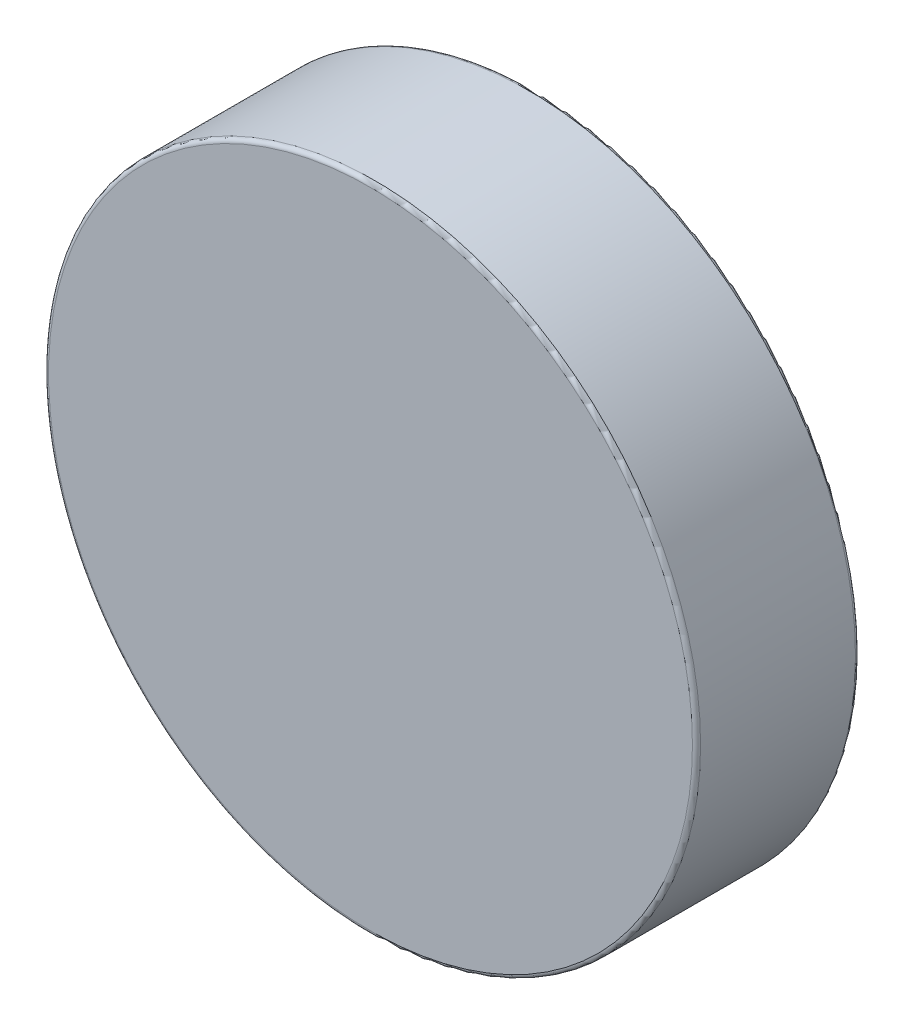
ISO-10303-21;
HEADER;
FILE_DESCRIPTION(('STEP AP214'),'2;1');
FILE_NAME('part.step','',(''),(''),'','','');
FILE_SCHEMA(('AUTOMOTIVE_DESIGN { 1 0 10303 214 1 1 1 1 }'));
ENDSEC;
DATA;
#1=APPLICATION_CONTEXT('core data for automotive mechanical design processes');
#2=APPLICATION_PROTOCOL_DEFINITION('international standard','automotive_design',2000,#1);
#3=PRODUCT_CONTEXT('',#1,'mechanical');
#4=PRODUCT('Part','Part','',(#3));
#5=PRODUCT_RELATED_PRODUCT_CATEGORY('part','',(#4));
#6=PRODUCT_DEFINITION_FORMATION('','',#4);
#7=PRODUCT_DEFINITION_CONTEXT('part definition',#1,'design');
#8=PRODUCT_DEFINITION('design','',#6,#7);
#9=PRODUCT_DEFINITION_SHAPE('','',#8);
#10=(LENGTH_UNIT() NAMED_UNIT(*) SI_UNIT(.MILLI.,.METRE.));
#11=(NAMED_UNIT(*) PLANE_ANGLE_UNIT() SI_UNIT($,.RADIAN.));
#12=(NAMED_UNIT(*) SI_UNIT($,.STERADIAN.) SOLID_ANGLE_UNIT());
#13=UNCERTAINTY_MEASURE_WITH_UNIT(LENGTH_MEASURE(1.E-05),#10,'distance_accuracy_value','');
#14=(GEOMETRIC_REPRESENTATION_CONTEXT(3) GLOBAL_UNCERTAINTY_ASSIGNED_CONTEXT((#13)) GLOBAL_UNIT_ASSIGNED_CONTEXT((#10,
#11,#12)) REPRESENTATION_CONTEXT('',''));
#15=CARTESIAN_POINT('',(0.,0.,0.));
#16=DIRECTION('',(0.,0.,1.));
#17=DIRECTION('',(1.,0.,0.));
#18=AXIS2_PLACEMENT_3D('',#15,#16,#17);
#19=CARTESIAN_POINT('',(0.,0.,0.79375));
#20=DIRECTION('',(0.,0.,-1.));
#21=DIRECTION('',(-1.,0.,0.));
#22=AXIS2_PLACEMENT_3D('',#19,#20,#21);
#23=CYLINDRICAL_SURFACE('',#22,3.175);
#24=CARTESIAN_POINT('',(0.,0.,-0.7540625));
#25=DIRECTION('',(0.,0.,1.));
#26=DIRECTION('',(1.,0.,0.));
#27=AXIS2_PLACEMENT_3D('',#24,#25,#26);
#28=CIRCLE('',#27,3.175);
#29=CARTESIAN_POINT('',(3.175,0.,-0.7540625));
#30=VERTEX_POINT('',#29);
#31=EDGE_CURVE('E41',#30,#30,#28,.T.);
#32=ORIENTED_EDGE('',*,*,#31,.T.);
#33=EDGE_LOOP('',(#32));
#34=FACE_BOUND('',#33,.T.);
#35=CARTESIAN_POINT('',(0.,0.,0.7540625));
#36=DIRECTION('',(0.,0.,1.));
#37=DIRECTION('',(1.,0.,0.));
#38=AXIS2_PLACEMENT_3D('',#35,#36,#37);
#39=CIRCLE('',#38,3.175);
#40=CARTESIAN_POINT('',(3.175,0.,0.7540625));
#41=VERTEX_POINT('',#40);
#42=EDGE_CURVE('E45',#41,#41,#39,.F.);
#43=ORIENTED_EDGE('',*,*,#42,.T.);
#44=EDGE_LOOP('',(#43));
#45=FACE_BOUND('',#44,.T.);
#46=ADVANCED_FACE('F30',(#34,#45),#23,.T.);
#47=CARTESIAN_POINT('',(0.,0.,0.79375));
#48=DIRECTION('',(0.,0.,1.));
#49=DIRECTION('',(1.,0.,0.));
#50=AXIS2_PLACEMENT_3D('',#47,#48,#49);
#51=PLANE('',#50);
#52=CARTESIAN_POINT('',(0.,0.,0.79375));
#53=DIRECTION('',(0.,0.,1.));
#54=DIRECTION('',(1.,0.,0.));
#55=AXIS2_PLACEMENT_3D('',#52,#53,#54);
#56=CIRCLE('',#55,3.1353125);
#57=CARTESIAN_POINT('',(3.1353125,0.,0.79375));
#58=VERTEX_POINT('',#57);
#59=EDGE_CURVE('E10',#58,#58,#56,.T.);
#60=ORIENTED_EDGE('',*,*,#59,.T.);
#61=EDGE_LOOP('',(#60));
#62=FACE_BOUND('',#61,.T.);
#63=ADVANCED_FACE('F61',(#62),#51,.T.);
#64=CARTESIAN_POINT('',(0.,0.,-0.79375));
#65=DIRECTION('',(0.,0.,1.));
#66=DIRECTION('',(1.,0.,0.));
#67=AXIS2_PLACEMENT_3D('',#64,#65,#66);
#68=PLANE('',#67);
#69=CARTESIAN_POINT('',(0.,0.,-0.79375));
#70=DIRECTION('',(0.,0.,1.));
#71=DIRECTION('',(1.,0.,0.));
#72=AXIS2_PLACEMENT_3D('',#69,#70,#71);
#73=CIRCLE('',#72,3.1353125);
#74=CARTESIAN_POINT('',(3.1353125,0.,-0.79375));
#75=VERTEX_POINT('',#74);
#76=EDGE_CURVE('E37',#75,#75,#73,.F.);
#77=ORIENTED_EDGE('',*,*,#76,.T.);
#78=EDGE_LOOP('',(#77));
#79=FACE_BOUND('',#78,.T.);
#80=ADVANCED_FACE('F58',(#79),#68,.F.);
#81=CARTESIAN_POINT('',(0.,0.,-0.7540625));
#82=DIRECTION('',(0.,0.,1.));
#83=DIRECTION('',(1.,0.,0.));
#84=AXIS2_PLACEMENT_3D('',#81,#82,#83);
#85=TOROIDAL_SURFACE('',#84,3.1353125,0.0396875);
#86=ORIENTED_EDGE('',*,*,#76,.F.);
#87=EDGE_LOOP('',(#86));
#88=FACE_BOUND('',#87,.T.);
#89=ORIENTED_EDGE('',*,*,#31,.F.);
#90=EDGE_LOOP('',(#89));
#91=FACE_BOUND('',#90,.T.);
#92=ADVANCED_FACE('F54',(#88,#91),#85,.T.);
#93=CARTESIAN_POINT('',(0.,0.,0.7540625));
#94=DIRECTION('',(0.,0.,1.));
#95=DIRECTION('',(1.,0.,0.));
#96=AXIS2_PLACEMENT_3D('',#93,#94,#95);
#97=TOROIDAL_SURFACE('',#96,3.1353125,0.0396875);
#98=ORIENTED_EDGE('',*,*,#42,.F.);
#99=EDGE_LOOP('',(#98));
#100=FACE_BOUND('',#99,.T.);
#101=ORIENTED_EDGE('',*,*,#59,.F.);
#102=EDGE_LOOP('',(#101));
#103=FACE_BOUND('',#102,.T.);
#104=ADVANCED_FACE('F32',(#100,#103),#97,.T.);
#105=CLOSED_SHELL('',(#46,#63,#80,#92,#104));
#106=MANIFOLD_SOLID_BREP('B2',#105);
#107=ADVANCED_BREP_SHAPE_REPRESENTATION('',(#18,#106),#14);
#108=SHAPE_DEFINITION_REPRESENTATION(#9,#107);
ENDSEC;
END-ISO-10303-21;
